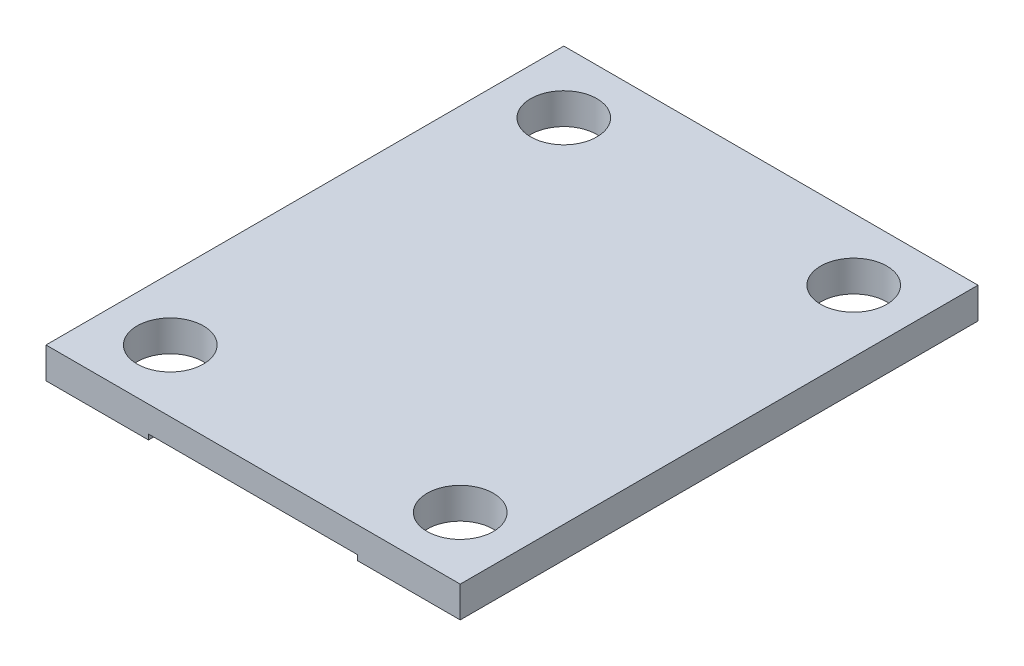
ISO-10303-21;
HEADER;
FILE_DESCRIPTION(('STEP AP214'),'2;1');
FILE_NAME('part.step','',(''),(''),'','','');
FILE_SCHEMA(('AUTOMOTIVE_DESIGN { 1 0 10303 214 1 1 1 1 }'));
ENDSEC;
DATA;
#1=APPLICATION_CONTEXT('core data for automotive mechanical design processes');
#2=APPLICATION_PROTOCOL_DEFINITION('international standard','automotive_design',2000,#1);
#3=PRODUCT_CONTEXT('',#1,'mechanical');
#4=PRODUCT('Part','Part','',(#3));
#5=PRODUCT_RELATED_PRODUCT_CATEGORY('part','',(#4));
#6=PRODUCT_DEFINITION_FORMATION('','',#4);
#7=PRODUCT_DEFINITION_CONTEXT('part definition',#1,'design');
#8=PRODUCT_DEFINITION('design','',#6,#7);
#9=PRODUCT_DEFINITION_SHAPE('','',#8);
#10=(LENGTH_UNIT() NAMED_UNIT(*) SI_UNIT(.MILLI.,.METRE.));
#11=(NAMED_UNIT(*) PLANE_ANGLE_UNIT() SI_UNIT($,.RADIAN.));
#12=(NAMED_UNIT(*) SI_UNIT($,.STERADIAN.) SOLID_ANGLE_UNIT());
#13=UNCERTAINTY_MEASURE_WITH_UNIT(LENGTH_MEASURE(1.E-05),#10,'distance_accuracy_value','');
#14=(GEOMETRIC_REPRESENTATION_CONTEXT(3) GLOBAL_UNCERTAINTY_ASSIGNED_CONTEXT((#13)) GLOBAL_UNIT_ASSIGNED_CONTEXT((#10,
#11,#12)) REPRESENTATION_CONTEXT('',''));
#15=CARTESIAN_POINT('',(0.,0.,0.));
#16=DIRECTION('',(0.,0.,1.));
#17=DIRECTION('',(1.,0.,0.));
#18=AXIS2_PLACEMENT_3D('',#15,#16,#17);
#19=CARTESIAN_POINT('',(0.,0.,0.));
#20=DIRECTION('',(0.,-1.,0.));
#21=DIRECTION('',(0.,0.,-1.));
#22=AXIS2_PLACEMENT_3D('',#19,#20,#21);
#23=PLANE('',#22);
#24=CARTESIAN_POINT('',(-7.,0.,7.));
#25=DIRECTION('',(0.,1.,0.));
#26=DIRECTION('',(0.,0.,1.));
#27=AXIS2_PLACEMENT_3D('',#24,#25,#26);
#28=CIRCLE('',#27,1.59999999999999);
#29=CARTESIAN_POINT('',(-7.,0.,8.59999999999999));
#30=VERTEX_POINT('',#29);
#31=EDGE_CURVE('E328',#30,#30,#28,.T.);
#32=ORIENTED_EDGE('',*,*,#31,.T.);
#33=EDGE_LOOP('',(#32));
#34=FACE_BOUND('',#33,.T.);
#35=DIRECTION('',(0.,0.,1.));
#36=VECTOR('',#35,1.);
#37=CARTESIAN_POINT('',(5.05,0.,-7.5));
#38=LINE('',#37,#36);
#39=CARTESIAN_POINT('',(5.05,0.,-7.5));
#40=VERTEX_POINT('',#39);
#41=CARTESIAN_POINT('',(5.05,0.,10.));
#42=VERTEX_POINT('',#41);
#43=EDGE_CURVE('E126',#40,#42,#38,.T.);
#44=ORIENTED_EDGE('',*,*,#43,.F.);
#45=DIRECTION('',(1.,0.,0.));
#46=VECTOR('',#45,1.);
#47=CARTESIAN_POINT('',(-5.05,0.,-7.5));
#48=LINE('',#47,#46);
#49=CARTESIAN_POINT('',(-5.05,0.,-7.5));
#50=VERTEX_POINT('',#49);
#51=EDGE_CURVE('E355',#50,#40,#48,.T.);
#52=ORIENTED_EDGE('',*,*,#51,.F.);
#53=DIRECTION('',(0.,0.,-1.));
#54=VECTOR('',#53,1.);
#55=CARTESIAN_POINT('',(-5.05,0.,10.));
#56=LINE('',#55,#54);
#57=CARTESIAN_POINT('',(-5.05,0.,10.));
#58=VERTEX_POINT('',#57);
#59=EDGE_CURVE('E351',#58,#50,#56,.T.);
#60=ORIENTED_EDGE('',*,*,#59,.F.);
#61=DIRECTION('',(-1.,0.,0.));
#62=VECTOR('',#61,1.);
#63=CARTESIAN_POINT('',(10.,0.,10.));
#64=LINE('',#63,#62);
#65=CARTESIAN_POINT('',(-10.,0.,10.));
#66=VERTEX_POINT('',#65);
#67=EDGE_CURVE('E131',#58,#66,#64,.T.);
#68=ORIENTED_EDGE('',*,*,#67,.T.);
#69=DIRECTION('',(0.,0.,-1.));
#70=VECTOR('',#69,1.);
#71=CARTESIAN_POINT('',(-10.,0.,10.));
#72=LINE('',#71,#70);
#73=CARTESIAN_POINT('',(-10.,0.,-15.));
#74=VERTEX_POINT('',#73);
#75=EDGE_CURVE('E141',#66,#74,#72,.T.);
#76=ORIENTED_EDGE('',*,*,#75,.T.);
#77=DIRECTION('',(1.,0.,0.));
#78=VECTOR('',#77,1.);
#79=CARTESIAN_POINT('',(-10.,0.,-15.));
#80=LINE('',#79,#78);
#81=CARTESIAN_POINT('',(10.,0.,-15.));
#82=VERTEX_POINT('',#81);
#83=EDGE_CURVE('E148',#74,#82,#80,.T.);
#84=ORIENTED_EDGE('',*,*,#83,.T.);
#85=DIRECTION('',(0.,0.,1.));
#86=VECTOR('',#85,1.);
#87=CARTESIAN_POINT('',(10.,0.,-15.));
#88=LINE('',#87,#86);
#89=CARTESIAN_POINT('',(10.,0.,10.));
#90=VERTEX_POINT('',#89);
#91=EDGE_CURVE('E151',#82,#90,#88,.T.);
#92=ORIENTED_EDGE('',*,*,#91,.T.);
#93=EDGE_CURVE('E155',#90,#42,#64,.T.);
#94=ORIENTED_EDGE('',*,*,#93,.T.);
#95=EDGE_LOOP('',(#44,#52,#60,#68,#76,#84,#92,#94));
#96=FACE_BOUND('',#95,.T.);
#97=CARTESIAN_POINT('',(7.,0.,-12.));
#98=DIRECTION('',(0.,-1.,0.));
#99=DIRECTION('',(0.,0.,-1.));
#100=AXIS2_PLACEMENT_3D('',#97,#98,#99);
#101=CIRCLE('',#100,1.59999999999999);
#102=CARTESIAN_POINT('',(7.,0.,-13.6));
#103=VERTEX_POINT('',#102);
#104=EDGE_CURVE('E346',#103,#103,#101,.T.);
#105=ORIENTED_EDGE('',*,*,#104,.F.);
#106=EDGE_LOOP('',(#105));
#107=FACE_BOUND('',#106,.T.);
#108=CARTESIAN_POINT('',(7.,0.,7.));
#109=DIRECTION('',(0.,-1.,0.));
#110=DIRECTION('',(0.,0.,-1.));
#111=AXIS2_PLACEMENT_3D('',#108,#109,#110);
#112=CIRCLE('',#111,1.59999999999999);
#113=CARTESIAN_POINT('',(7.,0.,5.40000000000001));
#114=VERTEX_POINT('',#113);
#115=EDGE_CURVE('E340',#114,#114,#112,.T.);
#116=ORIENTED_EDGE('',*,*,#115,.F.);
#117=EDGE_LOOP('',(#116));
#118=FACE_BOUND('',#117,.T.);
#119=CARTESIAN_POINT('',(-7.,0.,-12.));
#120=DIRECTION('',(0.,1.,0.));
#121=DIRECTION('',(0.,0.,1.));
#122=AXIS2_PLACEMENT_3D('',#119,#120,#121);
#123=CIRCLE('',#122,1.59999999999999);
#124=CARTESIAN_POINT('',(-7.,0.,-10.4));
#125=VERTEX_POINT('',#124);
#126=EDGE_CURVE('E337',#125,#125,#123,.T.);
#127=ORIENTED_EDGE('',*,*,#126,.T.);
#128=EDGE_LOOP('',(#127));
#129=FACE_BOUND('',#128,.T.);
#130=ADVANCED_FACE('F37',(#34,#96,#107,#118,#129),#23,.T.);
#131=CARTESIAN_POINT('',(-10.,1.5,-15.));
#132=DIRECTION('',(0.,0.,-1.));
#133=DIRECTION('',(-1.,0.,0.));
#134=AXIS2_PLACEMENT_3D('',#131,#132,#133);
#135=PLANE('',#134);
#136=ORIENTED_EDGE('',*,*,#83,.F.);
#137=DIRECTION('',(0.,-1.,0.));
#138=VECTOR('',#137,1.);
#139=CARTESIAN_POINT('',(-10.,1.5,-15.));
#140=LINE('',#139,#138);
#141=CARTESIAN_POINT('',(-10.,1.5,-15.));
#142=VERTEX_POINT('',#141);
#143=EDGE_CURVE('E11',#142,#74,#140,.T.);
#144=ORIENTED_EDGE('',*,*,#143,.F.);
#145=DIRECTION('',(1.,0.,0.));
#146=VECTOR('',#145,1.);
#147=CARTESIAN_POINT('',(-10.,1.5,-15.));
#148=LINE('',#147,#146);
#149=CARTESIAN_POINT('',(10.,1.5,-15.));
#150=VERTEX_POINT('',#149);
#151=EDGE_CURVE('E138',#142,#150,#148,.T.);
#152=ORIENTED_EDGE('',*,*,#151,.T.);
#153=DIRECTION('',(0.,-1.,0.));
#154=VECTOR('',#153,1.);
#155=CARTESIAN_POINT('',(10.,1.5,-15.));
#156=LINE('',#155,#154);
#157=EDGE_CURVE('E41',#150,#82,#156,.T.);
#158=ORIENTED_EDGE('',*,*,#157,.T.);
#159=EDGE_LOOP('',(#136,#144,#152,#158));
#160=FACE_BOUND('',#159,.T.);
#161=ADVANCED_FACE('F39',(#160),#135,.T.);
#162=CARTESIAN_POINT('',(-10.,1.5,10.));
#163=DIRECTION('',(-1.,0.,0.));
#164=DIRECTION('',(0.,0.,1.));
#165=AXIS2_PLACEMENT_3D('',#162,#163,#164);
#166=PLANE('',#165);
#167=ORIENTED_EDGE('',*,*,#75,.F.);
#168=DIRECTION('',(0.,-1.,0.));
#169=VECTOR('',#168,1.);
#170=CARTESIAN_POINT('',(-10.,1.5,10.));
#171=LINE('',#170,#169);
#172=CARTESIAN_POINT('',(-10.,1.5,10.));
#173=VERTEX_POINT('',#172);
#174=EDGE_CURVE('E46',#173,#66,#171,.T.);
#175=ORIENTED_EDGE('',*,*,#174,.F.);
#176=DIRECTION('',(0.,0.,-1.));
#177=VECTOR('',#176,1.);
#178=CARTESIAN_POINT('',(-10.,1.5,10.));
#179=LINE('',#178,#177);
#180=EDGE_CURVE('E146',#173,#142,#179,.T.);
#181=ORIENTED_EDGE('',*,*,#180,.T.);
#182=ORIENTED_EDGE('',*,*,#143,.T.);
#183=EDGE_LOOP('',(#167,#175,#181,#182));
#184=FACE_BOUND('',#183,.T.);
#185=ADVANCED_FACE('F166',(#184),#166,.T.);
#186=CARTESIAN_POINT('',(10.,1.5,10.));
#187=DIRECTION('',(0.,0.,1.));
#188=DIRECTION('',(1.,0.,0.));
#189=AXIS2_PLACEMENT_3D('',#186,#187,#188);
#190=PLANE('',#189);
#191=DIRECTION('',(0.,-1.,0.));
#192=VECTOR('',#191,1.);
#193=CARTESIAN_POINT('',(5.05,0.25,10.));
#194=LINE('',#193,#192);
#195=CARTESIAN_POINT('',(5.05,0.25,10.));
#196=VERTEX_POINT('',#195);
#197=EDGE_CURVE('E152',#196,#42,#194,.T.);
#198=ORIENTED_EDGE('',*,*,#197,.T.);
#199=ORIENTED_EDGE('',*,*,#93,.F.);
#200=DIRECTION('',(0.,-1.,0.));
#201=VECTOR('',#200,1.);
#202=CARTESIAN_POINT('',(10.,1.5,10.));
#203=LINE('',#202,#201);
#204=CARTESIAN_POINT('',(10.,1.5,10.));
#205=VERTEX_POINT('',#204);
#206=EDGE_CURVE('E160',#205,#90,#203,.T.);
#207=ORIENTED_EDGE('',*,*,#206,.F.);
#208=DIRECTION('',(-1.,0.,0.));
#209=VECTOR('',#208,1.);
#210=CARTESIAN_POINT('',(10.,1.5,10.));
#211=LINE('',#210,#209);
#212=EDGE_CURVE('E143',#205,#173,#211,.T.);
#213=ORIENTED_EDGE('',*,*,#212,.T.);
#214=ORIENTED_EDGE('',*,*,#174,.T.);
#215=ORIENTED_EDGE('',*,*,#67,.F.);
#216=DIRECTION('',(0.,-1.,0.));
#217=VECTOR('',#216,1.);
#218=CARTESIAN_POINT('',(-5.05,0.25,10.));
#219=LINE('',#218,#217);
#220=CARTESIAN_POINT('',(-5.05,0.25,10.));
#221=VERTEX_POINT('',#220);
#222=EDGE_CURVE('E54',#221,#58,#219,.T.);
#223=ORIENTED_EDGE('',*,*,#222,.F.);
#224=DIRECTION('',(-1.,0.,0.));
#225=VECTOR('',#224,1.);
#226=CARTESIAN_POINT('',(5.05,0.25,10.));
#227=LINE('',#226,#225);
#228=EDGE_CURVE('E117',#196,#221,#227,.T.);
#229=ORIENTED_EDGE('',*,*,#228,.F.);
#230=EDGE_LOOP('',(#198,#199,#207,#213,#214,#215,#223,#229));
#231=FACE_BOUND('',#230,.T.);
#232=ADVANCED_FACE('F129',(#231),#190,.T.);
#233=CARTESIAN_POINT('',(10.,1.5,-15.));
#234=DIRECTION('',(1.,0.,0.));
#235=DIRECTION('',(0.,0.,-1.));
#236=AXIS2_PLACEMENT_3D('',#233,#234,#235);
#237=PLANE('',#236);
#238=ORIENTED_EDGE('',*,*,#91,.F.);
#239=ORIENTED_EDGE('',*,*,#157,.F.);
#240=DIRECTION('',(0.,0.,1.));
#241=VECTOR('',#240,1.);
#242=CARTESIAN_POINT('',(10.,1.5,-15.));
#243=LINE('',#242,#241);
#244=EDGE_CURVE('E140',#150,#205,#243,.T.);
#245=ORIENTED_EDGE('',*,*,#244,.T.);
#246=ORIENTED_EDGE('',*,*,#206,.T.);
#247=EDGE_LOOP('',(#238,#239,#245,#246));
#248=FACE_BOUND('',#247,.T.);
#249=ADVANCED_FACE('F162',(#248),#237,.T.);
#250=CARTESIAN_POINT('',(0.,1.5,0.));
#251=DIRECTION('',(0.,-1.,0.));
#252=DIRECTION('',(0.,0.,-1.));
#253=AXIS2_PLACEMENT_3D('',#250,#251,#252);
#254=PLANE('',#253);
#255=CARTESIAN_POINT('',(-7.,1.5,7.));
#256=DIRECTION('',(0.,1.,0.));
#257=DIRECTION('',(0.,0.,1.));
#258=AXIS2_PLACEMENT_3D('',#255,#256,#257);
#259=CIRCLE('',#258,1.59999999999999);
#260=CARTESIAN_POINT('',(-7.,1.5,8.59999999999999));
#261=VERTEX_POINT('',#260);
#262=EDGE_CURVE('E330',#261,#261,#259,.T.);
#263=ORIENTED_EDGE('',*,*,#262,.F.);
#264=EDGE_LOOP('',(#263));
#265=FACE_BOUND('',#264,.T.);
#266=CARTESIAN_POINT('',(-7.,1.5,-12.));
#267=DIRECTION('',(0.,1.,0.));
#268=DIRECTION('',(0.,0.,1.));
#269=AXIS2_PLACEMENT_3D('',#266,#267,#268);
#270=CIRCLE('',#269,1.59999999999999);
#271=CARTESIAN_POINT('',(-7.,1.5,-10.4));
#272=VERTEX_POINT('',#271);
#273=EDGE_CURVE('E332',#272,#272,#270,.T.);
#274=ORIENTED_EDGE('',*,*,#273,.F.);
#275=EDGE_LOOP('',(#274));
#276=FACE_BOUND('',#275,.T.);
#277=CARTESIAN_POINT('',(7.,1.5,7.));
#278=DIRECTION('',(0.,-1.,0.));
#279=DIRECTION('',(0.,0.,-1.));
#280=AXIS2_PLACEMENT_3D('',#277,#278,#279);
#281=CIRCLE('',#280,1.59999999999999);
#282=CARTESIAN_POINT('',(7.,1.5,5.40000000000001));
#283=VERTEX_POINT('',#282);
#284=EDGE_CURVE('E343',#283,#283,#281,.T.);
#285=ORIENTED_EDGE('',*,*,#284,.T.);
#286=EDGE_LOOP('',(#285));
#287=FACE_BOUND('',#286,.T.);
#288=CARTESIAN_POINT('',(7.,1.5,-12.));
#289=DIRECTION('',(0.,-1.,0.));
#290=DIRECTION('',(0.,0.,-1.));
#291=AXIS2_PLACEMENT_3D('',#288,#289,#290);
#292=CIRCLE('',#291,1.59999999999999);
#293=CARTESIAN_POINT('',(7.,1.5,-13.6));
#294=VERTEX_POINT('',#293);
#295=EDGE_CURVE('E349',#294,#294,#292,.T.);
#296=ORIENTED_EDGE('',*,*,#295,.T.);
#297=EDGE_LOOP('',(#296));
#298=FACE_BOUND('',#297,.T.);
#299=ORIENTED_EDGE('',*,*,#151,.F.);
#300=ORIENTED_EDGE('',*,*,#180,.F.);
#301=ORIENTED_EDGE('',*,*,#212,.F.);
#302=ORIENTED_EDGE('',*,*,#244,.F.);
#303=EDGE_LOOP('',(#299,#300,#301,#302));
#304=FACE_BOUND('',#303,.T.);
#305=ADVANCED_FACE('F170',(#265,#276,#287,#298,#304),#254,.F.);
#306=CARTESIAN_POINT('',(5.05,0.25,-7.5));
#307=DIRECTION('',(1.,0.,0.));
#308=DIRECTION('',(0.,0.,-1.));
#309=AXIS2_PLACEMENT_3D('',#306,#307,#308);
#310=PLANE('',#309);
#311=ORIENTED_EDGE('',*,*,#43,.T.);
#312=ORIENTED_EDGE('',*,*,#197,.F.);
#313=DIRECTION('',(0.,0.,1.));
#314=VECTOR('',#313,1.);
#315=CARTESIAN_POINT('',(5.05,0.25,-7.5));
#316=LINE('',#315,#314);
#317=CARTESIAN_POINT('',(5.05,0.25,-7.5));
#318=VERTEX_POINT('',#317);
#319=EDGE_CURVE('E123',#318,#196,#316,.T.);
#320=ORIENTED_EDGE('',*,*,#319,.F.);
#321=DIRECTION('',(0.,-1.,0.));
#322=VECTOR('',#321,1.);
#323=CARTESIAN_POINT('',(5.05,0.25,-7.5));
#324=LINE('',#323,#322);
#325=EDGE_CURVE('E133',#318,#40,#324,.T.);
#326=ORIENTED_EDGE('',*,*,#325,.T.);
#327=EDGE_LOOP('',(#311,#312,#320,#326));
#328=FACE_BOUND('',#327,.T.);
#329=ADVANCED_FACE('F172',(#328),#310,.F.);
#330=CARTESIAN_POINT('',(-5.05,0.25,-7.5));
#331=DIRECTION('',(0.,0.,-1.));
#332=DIRECTION('',(-1.,0.,0.));
#333=AXIS2_PLACEMENT_3D('',#330,#331,#332);
#334=PLANE('',#333);
#335=ORIENTED_EDGE('',*,*,#51,.T.);
#336=ORIENTED_EDGE('',*,*,#325,.F.);
#337=DIRECTION('',(1.,0.,0.));
#338=VECTOR('',#337,1.);
#339=CARTESIAN_POINT('',(-5.05,0.25,-7.5));
#340=LINE('',#339,#338);
#341=CARTESIAN_POINT('',(-5.05,0.25,-7.5));
#342=VERTEX_POINT('',#341);
#343=EDGE_CURVE('E116',#342,#318,#340,.T.);
#344=ORIENTED_EDGE('',*,*,#343,.F.);
#345=DIRECTION('',(0.,-1.,0.));
#346=VECTOR('',#345,1.);
#347=CARTESIAN_POINT('',(-5.05,0.25,-7.5));
#348=LINE('',#347,#346);
#349=EDGE_CURVE('E112',#342,#50,#348,.T.);
#350=ORIENTED_EDGE('',*,*,#349,.T.);
#351=EDGE_LOOP('',(#335,#336,#344,#350));
#352=FACE_BOUND('',#351,.T.);
#353=ADVANCED_FACE('F179',(#352),#334,.F.);
#354=CARTESIAN_POINT('',(-5.05,0.25,10.));
#355=DIRECTION('',(-1.,0.,0.));
#356=DIRECTION('',(0.,0.,1.));
#357=AXIS2_PLACEMENT_3D('',#354,#355,#356);
#358=PLANE('',#357);
#359=ORIENTED_EDGE('',*,*,#59,.T.);
#360=ORIENTED_EDGE('',*,*,#349,.F.);
#361=DIRECTION('',(0.,0.,-1.));
#362=VECTOR('',#361,1.);
#363=CARTESIAN_POINT('',(-5.05,0.25,10.));
#364=LINE('',#363,#362);
#365=EDGE_CURVE('E109',#221,#342,#364,.T.);
#366=ORIENTED_EDGE('',*,*,#365,.F.);
#367=ORIENTED_EDGE('',*,*,#222,.T.);
#368=EDGE_LOOP('',(#359,#360,#366,#367));
#369=FACE_BOUND('',#368,.T.);
#370=ADVANCED_FACE('F111',(#369),#358,.F.);
#371=CARTESIAN_POINT('',(0.,0.25,0.));
#372=DIRECTION('',(0.,-1.,0.));
#373=DIRECTION('',(0.,0.,-1.));
#374=AXIS2_PLACEMENT_3D('',#371,#372,#373);
#375=PLANE('',#374);
#376=ORIENTED_EDGE('',*,*,#228,.T.);
#377=ORIENTED_EDGE('',*,*,#365,.T.);
#378=ORIENTED_EDGE('',*,*,#343,.T.);
#379=ORIENTED_EDGE('',*,*,#319,.T.);
#380=EDGE_LOOP('',(#376,#377,#378,#379));
#381=FACE_BOUND('',#380,.T.);
#382=ADVANCED_FACE('F121',(#381),#375,.T.);
#383=CARTESIAN_POINT('',(7.,0.,-12.));
#384=DIRECTION('',(0.,-1.,0.));
#385=DIRECTION('',(0.,0.,-1.));
#386=AXIS2_PLACEMENT_3D('',#383,#384,#385);
#387=CYLINDRICAL_SURFACE('',#386,1.59999999999999);
#388=ORIENTED_EDGE('',*,*,#295,.F.);
#389=EDGE_LOOP('',(#388));
#390=FACE_BOUND('',#389,.T.);
#391=ORIENTED_EDGE('',*,*,#104,.T.);
#392=EDGE_LOOP('',(#391));
#393=FACE_BOUND('',#392,.T.);
#394=ADVANCED_FACE('F260',(#390,#393),#387,.F.);
#395=CARTESIAN_POINT('',(7.,0.,7.));
#396=DIRECTION('',(0.,-1.,0.));
#397=DIRECTION('',(0.,0.,-1.));
#398=AXIS2_PLACEMENT_3D('',#395,#396,#397);
#399=CYLINDRICAL_SURFACE('',#398,1.59999999999999);
#400=ORIENTED_EDGE('',*,*,#284,.F.);
#401=EDGE_LOOP('',(#400));
#402=FACE_BOUND('',#401,.T.);
#403=ORIENTED_EDGE('',*,*,#115,.T.);
#404=EDGE_LOOP('',(#403));
#405=FACE_BOUND('',#404,.T.);
#406=ADVANCED_FACE('F269',(#402,#405),#399,.F.);
#407=CARTESIAN_POINT('',(-7.,1.5,-12.));
#408=DIRECTION('',(0.,1.,0.));
#409=DIRECTION('',(0.,0.,1.));
#410=AXIS2_PLACEMENT_3D('',#407,#408,#409);
#411=CYLINDRICAL_SURFACE('',#410,1.59999999999999);
#412=ORIENTED_EDGE('',*,*,#126,.F.);
#413=EDGE_LOOP('',(#412));
#414=FACE_BOUND('',#413,.T.);
#415=ORIENTED_EDGE('',*,*,#273,.T.);
#416=EDGE_LOOP('',(#415));
#417=FACE_BOUND('',#416,.T.);
#418=ADVANCED_FACE('F279',(#414,#417),#411,.F.);
#419=CARTESIAN_POINT('',(-7.,1.5,7.));
#420=DIRECTION('',(0.,1.,0.));
#421=DIRECTION('',(0.,0.,1.));
#422=AXIS2_PLACEMENT_3D('',#419,#420,#421);
#423=CYLINDRICAL_SURFACE('',#422,1.59999999999999);
#424=ORIENTED_EDGE('',*,*,#31,.F.);
#425=EDGE_LOOP('',(#424));
#426=FACE_BOUND('',#425,.T.);
#427=ORIENTED_EDGE('',*,*,#262,.T.);
#428=EDGE_LOOP('',(#427));
#429=FACE_BOUND('',#428,.T.);
#430=ADVANCED_FACE('F295',(#426,#429),#423,.F.);
#431=CLOSED_SHELL('',(#130,#161,#185,#232,#249,#305,#329,#353,#370,#382,#394,#406,#418,#430));
#432=MANIFOLD_SOLID_BREP('B2',#431);
#433=ADVANCED_BREP_SHAPE_REPRESENTATION('',(#18,#432),#14);
#434=SHAPE_DEFINITION_REPRESENTATION(#9,#433);
ENDSEC;
END-ISO-10303-21;
